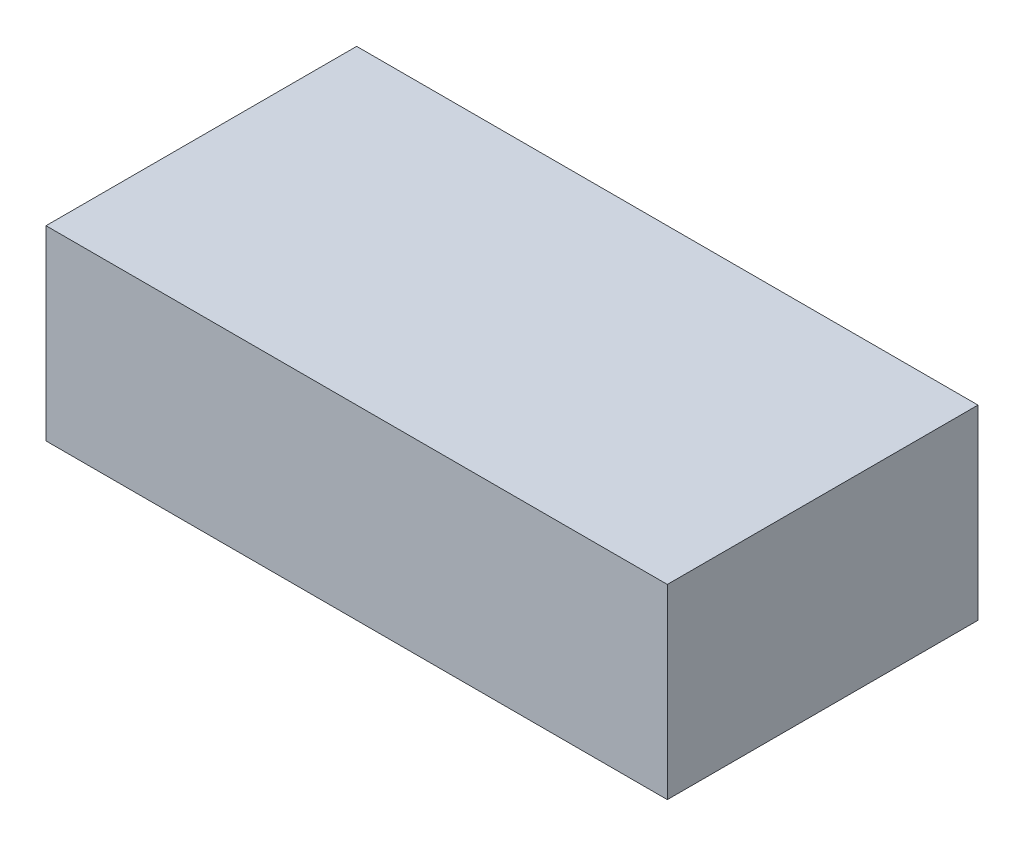
ISO-10303-21;
HEADER;
FILE_DESCRIPTION(('STEP AP214'),'2;1');
FILE_NAME('part.step','',(''),(''),'','','');
FILE_SCHEMA(('AUTOMOTIVE_DESIGN { 1 0 10303 214 1 1 1 1 }'));
ENDSEC;
DATA;
#1=APPLICATION_CONTEXT('core data for automotive mechanical design processes');
#2=APPLICATION_PROTOCOL_DEFINITION('international standard','automotive_design',2000,#1);
#3=PRODUCT_CONTEXT('',#1,'mechanical');
#4=PRODUCT('Part','Part','',(#3));
#5=PRODUCT_RELATED_PRODUCT_CATEGORY('part','',(#4));
#6=PRODUCT_DEFINITION_FORMATION('','',#4);
#7=PRODUCT_DEFINITION_CONTEXT('part definition',#1,'design');
#8=PRODUCT_DEFINITION('design','',#6,#7);
#9=PRODUCT_DEFINITION_SHAPE('','',#8);
#10=(LENGTH_UNIT() NAMED_UNIT(*) SI_UNIT(.MILLI.,.METRE.));
#11=(NAMED_UNIT(*) PLANE_ANGLE_UNIT() SI_UNIT($,.RADIAN.));
#12=(NAMED_UNIT(*) SI_UNIT($,.STERADIAN.) SOLID_ANGLE_UNIT());
#13=UNCERTAINTY_MEASURE_WITH_UNIT(LENGTH_MEASURE(1.E-05),#10,'distance_accuracy_value','');
#14=(GEOMETRIC_REPRESENTATION_CONTEXT(3) GLOBAL_UNCERTAINTY_ASSIGNED_CONTEXT((#13)) GLOBAL_UNIT_ASSIGNED_CONTEXT((#10,
#11,#12)) REPRESENTATION_CONTEXT('',''));
#15=CARTESIAN_POINT('',(0.,0.,0.));
#16=DIRECTION('',(0.,0.,1.));
#17=DIRECTION('',(1.,0.,0.));
#18=AXIS2_PLACEMENT_3D('',#15,#16,#17);
#19=CARTESIAN_POINT('',(-95.4999999999996,3.,10.));
#20=DIRECTION('',(-1.,0.,0.));
#21=DIRECTION('',(0.,0.,1.));
#22=AXIS2_PLACEMENT_3D('',#19,#20,#21);
#23=PLANE('',#22);
#24=DIRECTION('',(0.,1.,0.));
#25=VECTOR('',#24,1.);
#26=CARTESIAN_POINT('',(-95.4999999999996,3.,0.));
#27=LINE('',#26,#25);
#28=CARTESIAN_POINT('',(-95.4999999999996,-3.,0.));
#29=VERTEX_POINT('',#28);
#30=CARTESIAN_POINT('',(-95.4999999999996,3.,0.));
#31=VERTEX_POINT('',#30);
#32=EDGE_CURVE('E107',#29,#31,#27,.T.);
#33=ORIENTED_EDGE('',*,*,#32,.T.);
#34=DIRECTION('',(0.,0.,-1.));
#35=VECTOR('',#34,1.);
#36=CARTESIAN_POINT('',(-95.4999999999996,3.,10.));
#37=LINE('',#36,#35);
#38=CARTESIAN_POINT('',(-95.4999999999996,3.,10.));
#39=VERTEX_POINT('',#38);
#40=EDGE_CURVE('E11',#39,#31,#37,.T.);
#41=ORIENTED_EDGE('',*,*,#40,.F.);
#42=DIRECTION('',(0.,1.,0.));
#43=VECTOR('',#42,1.);
#44=CARTESIAN_POINT('',(-95.4999999999996,3.,10.));
#45=LINE('',#44,#43);
#46=CARTESIAN_POINT('',(-95.4999999999996,-3.,10.));
#47=VERTEX_POINT('',#46);
#48=EDGE_CURVE('E91',#47,#39,#45,.T.);
#49=ORIENTED_EDGE('',*,*,#48,.F.);
#50=DIRECTION('',(0.,0.,-1.));
#51=VECTOR('',#50,1.);
#52=CARTESIAN_POINT('',(-95.4999999999996,-3.,10.));
#53=LINE('',#52,#51);
#54=EDGE_CURVE('E103',#47,#29,#53,.T.);
#55=ORIENTED_EDGE('',*,*,#54,.T.);
#56=EDGE_LOOP('',(#33,#41,#49,#55));
#57=FACE_BOUND('',#56,.T.);
#58=ADVANCED_FACE('F39',(#57),#23,.F.);
#59=CARTESIAN_POINT('',(-115.5,3.,10.));
#60=DIRECTION('',(0.,-1.,0.));
#61=DIRECTION('',(0.,0.,-1.));
#62=AXIS2_PLACEMENT_3D('',#59,#60,#61);
#63=PLANE('',#62);
#64=DIRECTION('',(-1.,0.,0.));
#65=VECTOR('',#64,1.);
#66=CARTESIAN_POINT('',(-115.5,3.,0.));
#67=LINE('',#66,#65);
#68=CARTESIAN_POINT('',(-115.5,3.,0.));
#69=VERTEX_POINT('',#68);
#70=EDGE_CURVE('E96',#31,#69,#67,.T.);
#71=ORIENTED_EDGE('',*,*,#70,.T.);
#72=DIRECTION('',(0.,0.,-1.));
#73=VECTOR('',#72,1.);
#74=CARTESIAN_POINT('',(-115.5,3.,10.));
#75=LINE('',#74,#73);
#76=CARTESIAN_POINT('',(-115.5,3.,10.));
#77=VERTEX_POINT('',#76);
#78=EDGE_CURVE('E48',#77,#69,#75,.T.);
#79=ORIENTED_EDGE('',*,*,#78,.F.);
#80=DIRECTION('',(-1.,0.,0.));
#81=VECTOR('',#80,1.);
#82=CARTESIAN_POINT('',(-115.5,3.,10.));
#83=LINE('',#82,#81);
#84=EDGE_CURVE('E86',#39,#77,#83,.T.);
#85=ORIENTED_EDGE('',*,*,#84,.F.);
#86=ORIENTED_EDGE('',*,*,#40,.T.);
#87=EDGE_LOOP('',(#71,#79,#85,#86));
#88=FACE_BOUND('',#87,.T.);
#89=ADVANCED_FACE('F95',(#88),#63,.F.);
#90=CARTESIAN_POINT('',(-115.5,3.,10.));
#91=DIRECTION('',(1.,0.,0.));
#92=DIRECTION('',(0.,0.,-1.));
#93=AXIS2_PLACEMENT_3D('',#90,#91,#92);
#94=PLANE('',#93);
#95=DIRECTION('',(0.,-1.,0.));
#96=VECTOR('',#95,1.);
#97=CARTESIAN_POINT('',(-115.5,3.,0.));
#98=LINE('',#97,#96);
#99=CARTESIAN_POINT('',(-115.5,-3.,0.));
#100=VERTEX_POINT('',#99);
#101=EDGE_CURVE('E73',#69,#100,#98,.T.);
#102=ORIENTED_EDGE('',*,*,#101,.T.);
#103=DIRECTION('',(0.,0.,-1.));
#104=VECTOR('',#103,1.);
#105=CARTESIAN_POINT('',(-115.5,-3.,10.));
#106=LINE('',#105,#104);
#107=CARTESIAN_POINT('',(-115.5,-3.,10.));
#108=VERTEX_POINT('',#107);
#109=EDGE_CURVE('E98',#108,#100,#106,.T.);
#110=ORIENTED_EDGE('',*,*,#109,.F.);
#111=DIRECTION('',(0.,-1.,0.));
#112=VECTOR('',#111,1.);
#113=CARTESIAN_POINT('',(-115.5,3.,10.));
#114=LINE('',#113,#112);
#115=EDGE_CURVE('E89',#77,#108,#114,.T.);
#116=ORIENTED_EDGE('',*,*,#115,.F.);
#117=ORIENTED_EDGE('',*,*,#78,.T.);
#118=EDGE_LOOP('',(#102,#110,#116,#117));
#119=FACE_BOUND('',#118,.T.);
#120=ADVANCED_FACE('F99',(#119),#94,.F.);
#121=CARTESIAN_POINT('',(-115.5,-3.,10.));
#122=DIRECTION('',(0.,1.,0.));
#123=DIRECTION('',(0.,0.,1.));
#124=AXIS2_PLACEMENT_3D('',#121,#122,#123);
#125=PLANE('',#124);
#126=DIRECTION('',(1.,0.,0.));
#127=VECTOR('',#126,1.);
#128=CARTESIAN_POINT('',(-115.5,-3.,0.));
#129=LINE('',#128,#127);
#130=EDGE_CURVE('E79',#100,#29,#129,.T.);
#131=ORIENTED_EDGE('',*,*,#130,.T.);
#132=ORIENTED_EDGE('',*,*,#54,.F.);
#133=DIRECTION('',(1.,0.,0.));
#134=VECTOR('',#133,1.);
#135=CARTESIAN_POINT('',(-115.5,-3.,10.));
#136=LINE('',#135,#134);
#137=EDGE_CURVE('E56',#108,#47,#136,.T.);
#138=ORIENTED_EDGE('',*,*,#137,.F.);
#139=ORIENTED_EDGE('',*,*,#109,.T.);
#140=EDGE_LOOP('',(#131,#132,#138,#139));
#141=FACE_BOUND('',#140,.T.);
#142=ADVANCED_FACE('F120',(#141),#125,.F.);
#143=CARTESIAN_POINT('',(0.,0.,10.));
#144=DIRECTION('',(0.,0.,1.));
#145=DIRECTION('',(1.,0.,0.));
#146=AXIS2_PLACEMENT_3D('',#143,#144,#145);
#147=PLANE('',#146);
#148=ORIENTED_EDGE('',*,*,#48,.T.);
#149=ORIENTED_EDGE('',*,*,#84,.T.);
#150=ORIENTED_EDGE('',*,*,#115,.T.);
#151=ORIENTED_EDGE('',*,*,#137,.T.);
#152=EDGE_LOOP('',(#148,#149,#150,#151));
#153=FACE_BOUND('',#152,.T.);
#154=ADVANCED_FACE('F87',(#153),#147,.T.);
#155=CARTESIAN_POINT('',(0.,0.,0.));
#156=DIRECTION('',(0.,0.,1.));
#157=DIRECTION('',(1.,0.,0.));
#158=AXIS2_PLACEMENT_3D('',#155,#156,#157);
#159=PLANE('',#158);
#160=ORIENTED_EDGE('',*,*,#32,.F.);
#161=ORIENTED_EDGE('',*,*,#130,.F.);
#162=ORIENTED_EDGE('',*,*,#101,.F.);
#163=ORIENTED_EDGE('',*,*,#70,.F.);
#164=EDGE_LOOP('',(#160,#161,#162,#163));
#165=FACE_BOUND('',#164,.T.);
#166=ADVANCED_FACE('F123',(#165),#159,.F.);
#167=CLOSED_SHELL('',(#58,#89,#120,#142,#154,#166));
#168=MANIFOLD_SOLID_BREP('B2',#167);
#169=ADVANCED_BREP_SHAPE_REPRESENTATION('',(#18,#168),#14);
#170=SHAPE_DEFINITION_REPRESENTATION(#9,#169);
ENDSEC;
END-ISO-10303-21;
